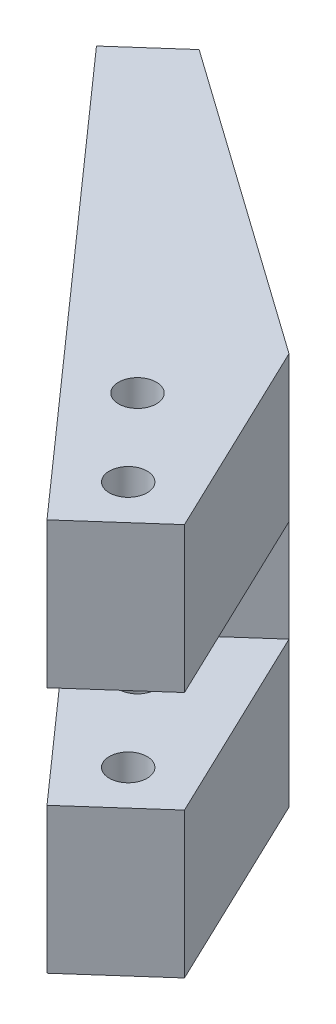
ISO-10303-21;
HEADER;
FILE_DESCRIPTION(('STEP AP214'),'2;1');
FILE_NAME('part.step','',(''),(''),'','','');
FILE_SCHEMA(('AUTOMOTIVE_DESIGN { 1 0 10303 214 1 1 1 1 }'));
ENDSEC;
DATA;
#1=APPLICATION_CONTEXT('core data for automotive mechanical design processes');
#2=APPLICATION_PROTOCOL_DEFINITION('international standard','automotive_design',2000,#1);
#3=PRODUCT_CONTEXT('',#1,'mechanical');
#4=PRODUCT('Part','Part','',(#3));
#5=PRODUCT_RELATED_PRODUCT_CATEGORY('part','',(#4));
#6=PRODUCT_DEFINITION_FORMATION('','',#4);
#7=PRODUCT_DEFINITION_CONTEXT('part definition',#1,'design');
#8=PRODUCT_DEFINITION('design','',#6,#7);
#9=PRODUCT_DEFINITION_SHAPE('','',#8);
#10=(LENGTH_UNIT() NAMED_UNIT(*) SI_UNIT(.MILLI.,.METRE.));
#11=(NAMED_UNIT(*) PLANE_ANGLE_UNIT() SI_UNIT($,.RADIAN.));
#12=(NAMED_UNIT(*) SI_UNIT($,.STERADIAN.) SOLID_ANGLE_UNIT());
#13=UNCERTAINTY_MEASURE_WITH_UNIT(LENGTH_MEASURE(1.E-05),#10,'distance_accuracy_value','');
#14=(GEOMETRIC_REPRESENTATION_CONTEXT(3) GLOBAL_UNCERTAINTY_ASSIGNED_CONTEXT((#13)) GLOBAL_UNIT_ASSIGNED_CONTEXT((#10,
#11,#12)) REPRESENTATION_CONTEXT('',''));
#15=CARTESIAN_POINT('',(0.,0.,0.));
#16=DIRECTION('',(0.,0.,1.));
#17=DIRECTION('',(1.,0.,0.));
#18=AXIS2_PLACEMENT_3D('',#15,#16,#17);
#19=CARTESIAN_POINT('',(-42.4038381091014,-17.,-30.0407554689908));
#20=DIRECTION('',(0.578077609110316,0.,-0.815981787692164));
#21=DIRECTION('',(-0.815981787692164,0.,-0.578077609110316));
#22=AXIS2_PLACEMENT_3D('',#19,#20,#21);
#23=PLANE('',#22);
#24=DIRECTION('',(0.815981787692164,0.,0.578077609110316));
#25=VECTOR('',#24,1.);
#26=CARTESIAN_POINT('',(-42.4038381091014,-20.,-30.0407554689908));
#27=LINE('',#26,#25);
#28=CARTESIAN_POINT('',(-42.4038381091014,-20.,-30.0407554689908));
#29=VERTEX_POINT('',#28);
#30=CARTESIAN_POINT('',(0.,-20.,0.));
#31=VERTEX_POINT('',#30);
#32=EDGE_CURVE('E240',#29,#31,#27,.T.);
#33=ORIENTED_EDGE('',*,*,#32,.F.);
#34=DIRECTION('',(0.,-1.,0.));
#35=VECTOR('',#34,1.);
#36=CARTESIAN_POINT('',(-42.4038381091014,-17.,-30.0407554689908));
#37=LINE('',#36,#35);
#38=CARTESIAN_POINT('',(-42.4038381091014,-17.,-30.0407554689908));
#39=VERTEX_POINT('',#38);
#40=EDGE_CURVE('E228',#39,#29,#37,.T.);
#41=ORIENTED_EDGE('',*,*,#40,.F.);
#42=DIRECTION('',(0.815981787692164,0.,0.578077609110316));
#43=VECTOR('',#42,1.);
#44=CARTESIAN_POINT('',(-42.4038381091014,-17.,-30.0407554689908));
#45=LINE('',#44,#43);
#46=CARTESIAN_POINT('',(0.,-17.,0.));
#47=VERTEX_POINT('',#46);
#48=EDGE_CURVE('E229',#39,#47,#45,.T.);
#49=ORIENTED_EDGE('',*,*,#48,.T.);
#50=DIRECTION('',(0.,-1.,0.));
#51=VECTOR('',#50,1.);
#52=CARTESIAN_POINT('',(0.,-17.,0.));
#53=LINE('',#52,#51);
#54=EDGE_CURVE('E245',#47,#31,#53,.T.);
#55=ORIENTED_EDGE('',*,*,#54,.T.);
#56=EDGE_LOOP('',(#33,#41,#49,#55));
#57=FACE_BOUND('',#56,.T.);
#58=ADVANCED_FACE('F42',(#57),#23,.T.);
#59=CARTESIAN_POINT('',(-49.8875630877834,-17.,-23.4079686909125));
#60=DIRECTION('',(-0.663278677807829,0.,-0.748372497868206));
#61=DIRECTION('',(-0.748372497868206,0.,0.663278677807829));
#62=AXIS2_PLACEMENT_3D('',#59,#60,#61);
#63=PLANE('',#62);
#64=DIRECTION('',(0.748372497868206,0.,-0.663278677807829));
#65=VECTOR('',#64,1.);
#66=CARTESIAN_POINT('',(-49.8875630877834,-20.,-23.4079686909125));
#67=LINE('',#66,#65);
#68=CARTESIAN_POINT('',(-49.8875630877834,-20.,-23.4079686909125));
#69=VERTEX_POINT('',#68);
#70=EDGE_CURVE('E226',#69,#29,#67,.T.);
#71=ORIENTED_EDGE('',*,*,#70,.F.);
#72=DIRECTION('',(0.,-1.,0.));
#73=VECTOR('',#72,1.);
#74=CARTESIAN_POINT('',(-49.8875630877834,-17.,-23.4079686909125));
#75=LINE('',#74,#73);
#76=CARTESIAN_POINT('',(-49.8875630877834,-17.,-23.4079686909125));
#77=VERTEX_POINT('',#76);
#78=EDGE_CURVE('E217',#77,#69,#75,.T.);
#79=ORIENTED_EDGE('',*,*,#78,.F.);
#80=DIRECTION('',(0.748372497868206,0.,-0.663278677807829));
#81=VECTOR('',#80,1.);
#82=CARTESIAN_POINT('',(-49.8875630877834,-17.,-23.4079686909125));
#83=LINE('',#82,#81);
#84=EDGE_CURVE('E224',#77,#39,#83,.T.);
#85=ORIENTED_EDGE('',*,*,#84,.T.);
#86=ORIENTED_EDGE('',*,*,#40,.T.);
#87=EDGE_LOOP('',(#71,#79,#85,#86));
#88=FACE_BOUND('',#87,.T.);
#89=ADVANCED_FACE('F223',(#88),#63,.T.);
#90=CARTESIAN_POINT('',(-40.458581161233,34.,-20.0771580044902));
#91=DIRECTION('',(0.333081068642229,0.,-0.942898192655045));
#92=DIRECTION('',(-0.942898192655045,0.,-0.333081068642229));
#93=AXIS2_PLACEMENT_3D('',#90,#91,#92);
#94=PLANE('',#93);
#95=DIRECTION('',(0.,-1.,0.));
#96=VECTOR('',#95,1.);
#97=CARTESIAN_POINT('',(-49.8875630877834,34.,-23.4079686909125));
#98=LINE('',#97,#96);
#99=CARTESIAN_POINT('',(-49.8875630877834,31.,-23.4079686909125));
#100=VERTEX_POINT('',#99);
#101=EDGE_CURVE('E186',#100,#77,#98,.T.);
#102=ORIENTED_EDGE('',*,*,#101,.F.);
#103=DIRECTION('',(0.942898192655045,0.,0.333081068642229));
#104=VECTOR('',#103,1.);
#105=CARTESIAN_POINT('',(-40.458581161233,31.,-20.0771580044902));
#106=LINE('',#105,#104);
#107=CARTESIAN_POINT('',(-40.458581161233,31.,-20.0771580044902));
#108=VERTEX_POINT('',#107);
#109=EDGE_CURVE('E68',#100,#108,#106,.T.);
#110=ORIENTED_EDGE('',*,*,#109,.T.);
#111=DIRECTION('',(0.,-1.,0.));
#112=VECTOR('',#111,1.);
#113=CARTESIAN_POINT('',(-40.458581161233,34.,-20.0771580044902));
#114=LINE('',#113,#112);
#115=CARTESIAN_POINT('',(-40.458581161233,-17.,-20.0771580044902));
#116=VERTEX_POINT('',#115);
#117=EDGE_CURVE('E208',#108,#116,#114,.T.);
#118=ORIENTED_EDGE('',*,*,#117,.T.);
#119=DIRECTION('',(0.942898192655045,0.,0.333081068642229));
#120=VECTOR('',#119,1.);
#121=CARTESIAN_POINT('',(-40.458581161233,-17.,-20.0771580044902));
#122=LINE('',#121,#120);
#123=EDGE_CURVE('E236',#77,#116,#122,.T.);
#124=ORIENTED_EDGE('',*,*,#123,.F.);
#125=EDGE_LOOP('',(#102,#110,#118,#124));
#126=FACE_BOUND('',#125,.T.);
#127=ADVANCED_FACE('F242',(#126),#94,.T.);
#128=CARTESIAN_POINT('',(-1.2133730085125,31.,-66.5476518448374));
#129=DIRECTION('',(0.663278677807829,0.,0.748372497868206));
#130=DIRECTION('',(0.748372497868206,0.,-0.663278677807829));
#131=AXIS2_PLACEMENT_3D('',#128,#129,#130);
#132=PLANE('',#131);
#133=DIRECTION('',(0.748372497868206,0.,-0.663278677807829));
#134=VECTOR('',#133,1.);
#135=CARTESIAN_POINT('',(-1.2133730085125,34.,-66.5476518448374));
#136=LINE('',#135,#134);
#137=CARTESIAN_POINT('',(-49.8875630877834,34.,-23.4079686909125));
#138=VERTEX_POINT('',#137);
#139=CARTESIAN_POINT('',(-42.4038381091014,34.,-30.0407554689908));
#140=VERTEX_POINT('',#139);
#141=EDGE_CURVE('E307',#138,#140,#136,.T.);
#142=ORIENTED_EDGE('',*,*,#141,.T.);
#143=DIRECTION('',(0.,1.,0.));
#144=VECTOR('',#143,1.);
#145=CARTESIAN_POINT('',(-42.4038381091014,31.,-30.0407554689908));
#146=LINE('',#145,#144);
#147=CARTESIAN_POINT('',(-42.4038381091014,31.,-30.0407554689908));
#148=VERTEX_POINT('',#147);
#149=EDGE_CURVE('E310',#148,#140,#146,.T.);
#150=ORIENTED_EDGE('',*,*,#149,.F.);
#151=DIRECTION('',(0.748372497868206,0.,-0.663278677807829));
#152=VECTOR('',#151,1.);
#153=CARTESIAN_POINT('',(-1.2133730085125,31.,-66.5476518448374));
#154=LINE('',#153,#152);
#155=EDGE_CURVE('E306',#100,#148,#154,.T.);
#156=ORIENTED_EDGE('',*,*,#155,.F.);
#157=EDGE_CURVE('E210',#138,#100,#98,.T.);
#158=ORIENTED_EDGE('',*,*,#157,.F.);
#159=EDGE_LOOP('',(#142,#150,#156,#158));
#160=FACE_BOUND('',#159,.T.);
#161=ADVANCED_FACE('F422',(#160),#132,.F.);
#162=CARTESIAN_POINT('',(0.,-17.,0.));
#163=DIRECTION('',(0.,1.,0.));
#164=DIRECTION('',(0.,0.,1.));
#165=AXIS2_PLACEMENT_3D('',#162,#163,#164);
#166=PLANE('',#165);
#167=DIRECTION('',(0.663278677807826,0.,0.748372497868209));
#168=VECTOR('',#167,1.);
#169=CARTESIAN_POINT('',(-40.458581161233,-17.,-20.0771580044902));
#170=LINE('',#169,#168);
#171=CARTESIAN_POINT('',(-20.5602208269982,-17.,2.37401693155606));
#172=VERTEX_POINT('',#171);
#173=EDGE_CURVE('E244',#116,#172,#170,.T.);
#174=ORIENTED_EDGE('',*,*,#173,.T.);
#175=CARTESIAN_POINT('',(-20.6309126816825,-17.,-88.4563203334623));
#176=DIRECTION('',(0.,1.,0.));
#177=DIRECTION('',(0.,0.,1.));
#178=AXIS2_PLACEMENT_3D('',#175,#176,#177);
#179=CIRCLE('',#178,90.8303647742059);
#180=EDGE_CURVE('E249',#172,#47,#179,.T.);
#181=ORIENTED_EDGE('',*,*,#180,.T.);
#182=ORIENTED_EDGE('',*,*,#48,.F.);
#183=ORIENTED_EDGE('',*,*,#84,.F.);
#184=ORIENTED_EDGE('',*,*,#123,.T.);
#185=EDGE_LOOP('',(#174,#181,#182,#183,#184));
#186=FACE_BOUND('',#185,.T.);
#187=ADVANCED_FACE('F235',(#186),#166,.T.);
#188=CARTESIAN_POINT('',(0.,31.,0.));
#189=DIRECTION('',(0.,1.,0.));
#190=DIRECTION('',(0.,0.,1.));
#191=AXIS2_PLACEMENT_3D('',#188,#189,#190);
#192=PLANE('',#191);
#193=CARTESIAN_POINT('',(-20.6309126816825,31.,-88.4563203334623));
#194=DIRECTION('',(0.,1.,0.));
#195=DIRECTION('',(0.,0.,1.));
#196=AXIS2_PLACEMENT_3D('',#193,#194,#195);
#197=CIRCLE('',#196,90.8303647742059);
#198=CARTESIAN_POINT('',(-20.5602208269982,31.,2.37401693155606));
#199=VERTEX_POINT('',#198);
#200=CARTESIAN_POINT('',(0.,31.,0.));
#201=VERTEX_POINT('',#200);
#202=EDGE_CURVE('E181',#199,#201,#197,.T.);
#203=ORIENTED_EDGE('',*,*,#202,.F.);
#204=DIRECTION('',(0.663278677807826,0.,0.748372497868209));
#205=VECTOR('',#204,1.);
#206=CARTESIAN_POINT('',(-40.458581161233,31.,-20.0771580044902));
#207=LINE('',#206,#205);
#208=EDGE_CURVE('E60',#108,#199,#207,.T.);
#209=ORIENTED_EDGE('',*,*,#208,.F.);
#210=ORIENTED_EDGE('',*,*,#109,.F.);
#211=ORIENTED_EDGE('',*,*,#155,.T.);
#212=DIRECTION('',(0.815981787692164,0.,0.578077609110317));
#213=VECTOR('',#212,1.);
#214=CARTESIAN_POINT('',(-55.4615209459452,31.,-39.2913958493263));
#215=LINE('',#214,#213);
#216=EDGE_CURVE('E303',#148,#201,#215,.T.);
#217=ORIENTED_EDGE('',*,*,#216,.T.);
#218=EDGE_LOOP('',(#203,#209,#210,#211,#217));
#219=FACE_BOUND('',#218,.T.);
#220=ADVANCED_FACE('F419',(#219),#192,.F.);
#221=CARTESIAN_POINT('',(-40.458581161233,34.,-20.0771580044902));
#222=DIRECTION('',(0.748372497868209,0.,-0.663278677807826));
#223=DIRECTION('',(-0.663278677807826,0.,-0.748372497868209));
#224=AXIS2_PLACEMENT_3D('',#221,#222,#223);
#225=PLANE('',#224);
#226=ORIENTED_EDGE('',*,*,#117,.F.);
#227=ORIENTED_EDGE('',*,*,#208,.T.);
#228=DIRECTION('',(0.,-1.,0.));
#229=VECTOR('',#228,1.);
#230=CARTESIAN_POINT('',(-20.5602208269982,34.,2.37401693155606));
#231=LINE('',#230,#229);
#232=EDGE_CURVE('E205',#199,#172,#231,.T.);
#233=ORIENTED_EDGE('',*,*,#232,.T.);
#234=ORIENTED_EDGE('',*,*,#173,.F.);
#235=EDGE_LOOP('',(#226,#227,#233,#234));
#236=FACE_BOUND('',#235,.T.);
#237=ADVANCED_FACE('F416',(#236),#225,.T.);
#238=CARTESIAN_POINT('',(-55.4615209459452,31.,-39.2913958493263));
#239=DIRECTION('',(-0.578077609110316,0.,0.815981787692164));
#240=DIRECTION('',(0.815981787692164,0.,0.578077609110317));
#241=AXIS2_PLACEMENT_3D('',#238,#239,#240);
#242=PLANE('',#241);
#243=DIRECTION('',(0.815981787692164,0.,0.578077609110317));
#244=VECTOR('',#243,1.);
#245=CARTESIAN_POINT('',(-55.4615209459452,34.,-39.2913958493263));
#246=LINE('',#245,#244);
#247=CARTESIAN_POINT('',(0.,34.,0.));
#248=VERTEX_POINT('',#247);
#249=EDGE_CURVE('E298',#140,#248,#246,.T.);
#250=ORIENTED_EDGE('',*,*,#249,.T.);
#251=DIRECTION('',(0.,-1.,0.));
#252=VECTOR('',#251,1.);
#253=CARTESIAN_POINT('',(0.,34.,0.));
#254=LINE('',#253,#252);
#255=EDGE_CURVE('E162',#248,#201,#254,.T.);
#256=ORIENTED_EDGE('',*,*,#255,.T.);
#257=ORIENTED_EDGE('',*,*,#216,.F.);
#258=ORIENTED_EDGE('',*,*,#149,.T.);
#259=EDGE_LOOP('',(#250,#256,#257,#258));
#260=FACE_BOUND('',#259,.T.);
#261=ADVANCED_FACE('F412',(#260),#242,.F.);
#262=CARTESIAN_POINT('',(-20.6309126816825,-20.,-88.4563203334623));
#263=DIRECTION('',(0.,-1.,0.));
#264=DIRECTION('',(0.,0.,-1.));
#265=AXIS2_PLACEMENT_3D('',#262,#263,#264);
#266=PLANE('',#265);
#267=CARTESIAN_POINT('',(-5.73347810284436,-20.,15.1032992359979));
#268=DIRECTION('',(0.,-1.,0.));
#269=DIRECTION('',(0.,0.,-1.));
#270=AXIS2_PLACEMENT_3D('',#267,#268,#269);
#271=CIRCLE('',#270,2.6);
#272=CARTESIAN_POINT('',(-5.73347810284436,-20.,12.5032992359979));
#273=VERTEX_POINT('',#272);
#274=EDGE_CURVE('E353',#273,#273,#271,.T.);
#275=ORIENTED_EDGE('',*,*,#274,.F.);
#276=EDGE_LOOP('',(#275));
#277=FACE_BOUND('',#276,.T.);
#278=CARTESIAN_POINT('',(4.21570206427303,-20.,26.328886704021));
#279=DIRECTION('',(0.,-1.,0.));
#280=DIRECTION('',(0.,0.,-1.));
#281=AXIS2_PLACEMENT_3D('',#278,#279,#280);
#282=CIRCLE('',#281,2.6);
#283=CARTESIAN_POINT('',(4.21570206427303,-20.,23.728886704021));
#284=VERTEX_POINT('',#283);
#285=EDGE_CURVE('E359',#284,#284,#282,.T.);
#286=ORIENTED_EDGE('',*,*,#285,.F.);
#287=EDGE_LOOP('',(#286));
#288=FACE_BOUND('',#287,.T.);
#289=ORIENTED_EDGE('',*,*,#32,.T.);
#290=DIRECTION('',(0.43130497023072,0.,0.902206197415135));
#291=VECTOR('',#290,1.);
#292=CARTESIAN_POINT('',(0.,-20.,0.));
#293=LINE('',#292,#291);
#294=CARTESIAN_POINT('',(13.1679328101233,-20.,27.544756978071));
#295=VERTEX_POINT('',#294);
#296=EDGE_CURVE('E276',#31,#295,#293,.T.);
#297=ORIENTED_EDGE('',*,*,#296,.T.);
#298=DIRECTION('',(0.748372497868209,0.,-0.663278677807826));
#299=VECTOR('',#298,1.);
#300=CARTESIAN_POINT('',(51.8190634145393,-20.,-6.7115403552783));
#301=LINE('',#300,#299);
#302=CARTESIAN_POINT('',(3.14487333526832,-20.,36.4281427986463));
#303=VERTEX_POINT('',#302);
#304=EDGE_CURVE('E52',#303,#295,#301,.T.);
#305=ORIENTED_EDGE('',*,*,#304,.F.);
#306=DIRECTION('',(-0.663278677807826,0.,-0.748372497868209));
#307=VECTOR('',#306,1.);
#308=CARTESIAN_POINT('',(-49.8875630877834,-20.,-23.4079686909125));
#309=LINE('',#308,#307);
#310=EDGE_CURVE('E201',#303,#69,#309,.T.);
#311=ORIENTED_EDGE('',*,*,#310,.T.);
#312=ORIENTED_EDGE('',*,*,#70,.T.);
#313=EDGE_LOOP('',(#289,#297,#305,#311,#312));
#314=FACE_BOUND('',#313,.T.);
#315=ADVANCED_FACE('F283',(#277,#288,#314),#266,.T.);
#316=CARTESIAN_POINT('',(-20.6309126816825,34.,-88.4563203334623));
#317=DIRECTION('',(0.,-1.,0.));
#318=DIRECTION('',(0.,0.,-1.));
#319=AXIS2_PLACEMENT_3D('',#316,#317,#318);
#320=PLANE('',#319);
#321=CARTESIAN_POINT('',(-5.73347810284436,34.,15.1032992359979));
#322=DIRECTION('',(0.,-1.,0.));
#323=DIRECTION('',(0.,0.,-1.));
#324=AXIS2_PLACEMENT_3D('',#321,#322,#323);
#325=CIRCLE('',#324,2.6);
#326=CARTESIAN_POINT('',(-5.73347810284436,34.,12.5032992359979));
#327=VERTEX_POINT('',#326);
#328=EDGE_CURVE('E345',#327,#327,#325,.T.);
#329=ORIENTED_EDGE('',*,*,#328,.T.);
#330=EDGE_LOOP('',(#329));
#331=FACE_BOUND('',#330,.T.);
#332=CARTESIAN_POINT('',(4.21570206427303,34.,26.328886704021));
#333=DIRECTION('',(0.,-1.,0.));
#334=DIRECTION('',(0.,0.,-1.));
#335=AXIS2_PLACEMENT_3D('',#332,#333,#334);
#336=CIRCLE('',#335,2.6);
#337=CARTESIAN_POINT('',(4.21570206427303,34.,23.728886704021));
#338=VERTEX_POINT('',#337);
#339=EDGE_CURVE('E365',#338,#338,#336,.T.);
#340=ORIENTED_EDGE('',*,*,#339,.T.);
#341=EDGE_LOOP('',(#340));
#342=FACE_BOUND('',#341,.T.);
#343=DIRECTION('',(0.43130497023072,0.,0.902206197415135));
#344=VECTOR('',#343,1.);
#345=CARTESIAN_POINT('',(0.,34.,0.));
#346=LINE('',#345,#344);
#347=CARTESIAN_POINT('',(13.1679328101233,34.,27.544756978071));
#348=VERTEX_POINT('',#347);
#349=EDGE_CURVE('E193',#248,#348,#346,.T.);
#350=ORIENTED_EDGE('',*,*,#349,.F.);
#351=ORIENTED_EDGE('',*,*,#249,.F.);
#352=ORIENTED_EDGE('',*,*,#141,.F.);
#353=DIRECTION('',(-0.663278677807826,0.,-0.748372497868209));
#354=VECTOR('',#353,1.);
#355=CARTESIAN_POINT('',(-49.8875630877834,34.,-23.4079686909125));
#356=LINE('',#355,#354);
#357=CARTESIAN_POINT('',(3.14487333526832,34.,36.4281427986463));
#358=VERTEX_POINT('',#357);
#359=EDGE_CURVE('E189',#358,#138,#356,.T.);
#360=ORIENTED_EDGE('',*,*,#359,.F.);
#361=DIRECTION('',(0.748372497868209,0.,-0.663278677807826));
#362=VECTOR('',#361,1.);
#363=CARTESIAN_POINT('',(51.8190634145393,34.,-6.71154035527831));
#364=LINE('',#363,#362);
#365=EDGE_CURVE('E11',#358,#348,#364,.T.);
#366=ORIENTED_EDGE('',*,*,#365,.T.);
#367=EDGE_LOOP('',(#350,#351,#352,#360,#366));
#368=FACE_BOUND('',#367,.T.);
#369=ADVANCED_FACE('F409',(#331,#342,#368),#320,.F.);
#370=CARTESIAN_POINT('',(25.5960482713146,0.,16.5297824644116));
#371=DIRECTION('',(-0.663278677807826,0.,-0.748372497868209));
#372=DIRECTION('',(-0.748372497868209,0.,0.663278677807826));
#373=AXIS2_PLACEMENT_3D('',#370,#371,#372);
#374=PLANE('',#373);
#375=DIRECTION('',(0.,1.,0.));
#376=VECTOR('',#375,1.);
#377=CARTESIAN_POINT('',(13.1679328101233,34.,27.544756978071));
#378=LINE('',#377,#376);
#379=CARTESIAN_POINT('',(13.1679328101233,0.,27.544756978071));
#380=VERTEX_POINT('',#379);
#381=EDGE_CURVE('E265',#295,#380,#378,.T.);
#382=ORIENTED_EDGE('',*,*,#381,.T.);
#383=DIRECTION('',(-0.748372497868209,0.,0.663278677807826));
#384=VECTOR('',#383,1.);
#385=CARTESIAN_POINT('',(25.5960482713146,0.,16.5297824644116));
#386=LINE('',#385,#384);
#387=CARTESIAN_POINT('',(3.14487333526835,0.,36.4281427986463));
#388=VERTEX_POINT('',#387);
#389=EDGE_CURVE('E256',#380,#388,#386,.T.);
#390=ORIENTED_EDGE('',*,*,#389,.T.);
#391=DIRECTION('',(0.,-1.,0.));
#392=VECTOR('',#391,1.);
#393=CARTESIAN_POINT('',(3.14487333526832,0.,36.4281427986463));
#394=LINE('',#393,#392);
#395=EDGE_CURVE('E262',#388,#303,#394,.T.);
#396=ORIENTED_EDGE('',*,*,#395,.T.);
#397=ORIENTED_EDGE('',*,*,#304,.T.);
#398=EDGE_LOOP('',(#382,#390,#396,#397));
#399=FACE_BOUND('',#398,.T.);
#400=ADVANCED_FACE('F288',(#399),#374,.F.);
#401=CARTESIAN_POINT('',(25.5960482713146,14.,16.5297824644116));
#402=DIRECTION('',(-0.663278677807826,0.,-0.748372497868209));
#403=DIRECTION('',(-0.748372497868209,0.,0.663278677807826));
#404=AXIS2_PLACEMENT_3D('',#401,#402,#403);
#405=PLANE('',#404);
#406=DIRECTION('',(0.,1.,0.));
#407=VECTOR('',#406,1.);
#408=CARTESIAN_POINT('',(13.1679328101233,34.,27.544756978071));
#409=LINE('',#408,#407);
#410=CARTESIAN_POINT('',(13.1679328101233,14.,27.544756978071));
#411=VERTEX_POINT('',#410);
#412=EDGE_CURVE('E169',#411,#348,#409,.T.);
#413=ORIENTED_EDGE('',*,*,#412,.T.);
#414=ORIENTED_EDGE('',*,*,#365,.F.);
#415=DIRECTION('',(0.,-1.,0.));
#416=VECTOR('',#415,1.);
#417=CARTESIAN_POINT('',(3.14487333526832,14.,36.4281427986463));
#418=LINE('',#417,#416);
#419=CARTESIAN_POINT('',(3.14487333526832,14.,36.4281427986463));
#420=VERTEX_POINT('',#419);
#421=EDGE_CURVE('E257',#358,#420,#418,.T.);
#422=ORIENTED_EDGE('',*,*,#421,.T.);
#423=DIRECTION('',(-0.748372497868209,0.,0.663278677807826));
#424=VECTOR('',#423,1.);
#425=CARTESIAN_POINT('',(25.5960482713146,14.,16.5297824644116));
#426=LINE('',#425,#424);
#427=EDGE_CURVE('E261',#411,#420,#426,.T.);
#428=ORIENTED_EDGE('',*,*,#427,.F.);
#429=EDGE_LOOP('',(#413,#414,#422,#428));
#430=FACE_BOUND('',#429,.T.);
#431=ADVANCED_FACE('F403',(#430),#405,.F.);
#432=CARTESIAN_POINT('',(0.,34.,0.));
#433=DIRECTION('',(0.902206197415135,0.,-0.43130497023072));
#434=DIRECTION('',(-0.43130497023072,0.,-0.902206197415135));
#435=AXIS2_PLACEMENT_3D('',#432,#433,#434);
#436=PLANE('',#435);
#437=DIRECTION('',(0.431304970230721,0.,0.902206197415135));
#438=VECTOR('',#437,1.);
#439=CARTESIAN_POINT('',(0.,14.,0.));
#440=LINE('',#439,#438);
#441=CARTESIAN_POINT('',(0.,14.,0.));
#442=VERTEX_POINT('',#441);
#443=EDGE_CURVE('E165',#442,#411,#440,.T.);
#444=ORIENTED_EDGE('',*,*,#443,.F.);
#445=EDGE_CURVE('E159',#201,#442,#254,.T.);
#446=ORIENTED_EDGE('',*,*,#445,.F.);
#447=ORIENTED_EDGE('',*,*,#255,.F.);
#448=ORIENTED_EDGE('',*,*,#349,.T.);
#449=ORIENTED_EDGE('',*,*,#412,.F.);
#450=EDGE_LOOP('',(#444,#446,#447,#448,#449));
#451=FACE_BOUND('',#450,.T.);
#452=ADVANCED_FACE('F166',(#451),#436,.T.);
#453=CARTESIAN_POINT('',(-20.6309126816825,34.,-88.4563203334623));
#454=DIRECTION('',(0.,-1.,0.));
#455=DIRECTION('',(0.,0.,-1.));
#456=AXIS2_PLACEMENT_3D('',#453,#454,#455);
#457=CYLINDRICAL_SURFACE('',#456,90.8303647742059);
#458=ORIENTED_EDGE('',*,*,#232,.F.);
#459=ORIENTED_EDGE('',*,*,#202,.T.);
#460=ORIENTED_EDGE('',*,*,#445,.T.);
#461=CARTESIAN_POINT('',(0.,0.,0.));
#462=VERTEX_POINT('',#461);
#463=EDGE_CURVE('E147',#442,#462,#254,.T.);
#464=ORIENTED_EDGE('',*,*,#463,.T.);
#465=EDGE_CURVE('E160',#462,#47,#254,.T.);
#466=ORIENTED_EDGE('',*,*,#465,.T.);
#467=ORIENTED_EDGE('',*,*,#180,.F.);
#468=EDGE_LOOP('',(#458,#459,#460,#464,#466,#467));
#469=FACE_BOUND('',#468,.T.);
#470=ADVANCED_FACE('F44',(#469),#457,.F.);
#471=CARTESIAN_POINT('',(-49.8875630877834,34.,-23.4079686909125));
#472=DIRECTION('',(-0.748372497868209,0.,0.663278677807826));
#473=DIRECTION('',(0.663278677807826,0.,0.748372497868209));
#474=AXIS2_PLACEMENT_3D('',#471,#472,#473);
#475=PLANE('',#474);
#476=DIRECTION('',(-0.663278677807826,0.,-0.748372497868209));
#477=VECTOR('',#476,1.);
#478=CARTESIAN_POINT('',(-49.8875630877834,14.,-23.4079686909125));
#479=LINE('',#478,#477);
#480=CARTESIAN_POINT('',(-16.3208619204146,14.,14.465095585545));
#481=VERTEX_POINT('',#480);
#482=EDGE_CURVE('E177',#420,#481,#479,.T.);
#483=ORIENTED_EDGE('',*,*,#482,.F.);
#484=ORIENTED_EDGE('',*,*,#421,.F.);
#485=ORIENTED_EDGE('',*,*,#359,.T.);
#486=ORIENTED_EDGE('',*,*,#157,.T.);
#487=ORIENTED_EDGE('',*,*,#101,.T.);
#488=ORIENTED_EDGE('',*,*,#78,.T.);
#489=ORIENTED_EDGE('',*,*,#310,.F.);
#490=ORIENTED_EDGE('',*,*,#395,.F.);
#491=DIRECTION('',(0.663278677807826,0.,0.748372497868209));
#492=VECTOR('',#491,1.);
#493=CARTESIAN_POINT('',(-49.8875630877834,0.,-23.4079686909125));
#494=LINE('',#493,#492);
#495=CARTESIAN_POINT('',(-16.3208619204146,0.,14.465095585545));
#496=VERTEX_POINT('',#495);
#497=EDGE_CURVE('E286',#496,#388,#494,.T.);
#498=ORIENTED_EDGE('',*,*,#497,.F.);
#499=DIRECTION('',(0.,-1.,0.));
#500=VECTOR('',#499,1.);
#501=CARTESIAN_POINT('',(-16.3208619204146,34.,14.465095585545));
#502=LINE('',#501,#500);
#503=EDGE_CURVE('E294',#481,#496,#502,.T.);
#504=ORIENTED_EDGE('',*,*,#503,.F.);
#505=EDGE_LOOP('',(#483,#484,#485,#486,#487,#488,#489,#490,#498,#504));
#506=FACE_BOUND('',#505,.T.);
#507=ADVANCED_FACE('F215',(#506),#475,.T.);
#508=ORIENTED_EDGE('',*,*,#465,.F.);
#509=DIRECTION('',(0.431304970230721,0.,0.902206197415135));
#510=VECTOR('',#509,1.);
#511=CARTESIAN_POINT('',(0.,0.,0.));
#512=LINE('',#511,#510);
#513=EDGE_CURVE('E173',#462,#380,#512,.T.);
#514=ORIENTED_EDGE('',*,*,#513,.T.);
#515=ORIENTED_EDGE('',*,*,#381,.F.);
#516=ORIENTED_EDGE('',*,*,#296,.F.);
#517=ORIENTED_EDGE('',*,*,#54,.F.);
#518=EDGE_LOOP('',(#508,#514,#515,#516,#517));
#519=FACE_BOUND('',#518,.T.);
#520=ADVANCED_FACE('F336',(#519),#436,.T.);
#521=CARTESIAN_POINT('',(51.4218923340496,0.,-45.5749574641788));
#522=DIRECTION('',(0.,-1.,0.));
#523=DIRECTION('',(0.,0.,-1.));
#524=AXIS2_PLACEMENT_3D('',#521,#522,#523);
#525=PLANE('',#524);
#526=CARTESIAN_POINT('',(-5.73347810284436,0.,15.1032992359979));
#527=DIRECTION('',(0.,-1.,0.));
#528=DIRECTION('',(0.,0.,-1.));
#529=AXIS2_PLACEMENT_3D('',#526,#527,#528);
#530=CIRCLE('',#529,2.6);
#531=CARTESIAN_POINT('',(-5.73347810284436,0.,12.5032992359979));
#532=VERTEX_POINT('',#531);
#533=EDGE_CURVE('E369',#532,#532,#530,.T.);
#534=ORIENTED_EDGE('',*,*,#533,.T.);
#535=EDGE_LOOP('',(#534));
#536=FACE_BOUND('',#535,.T.);
#537=CARTESIAN_POINT('',(4.21570206427303,0.,26.328886704021));
#538=DIRECTION('',(0.,-1.,0.));
#539=DIRECTION('',(0.,0.,-1.));
#540=AXIS2_PLACEMENT_3D('',#537,#538,#539);
#541=CIRCLE('',#540,2.6);
#542=CARTESIAN_POINT('',(4.21570206427303,0.,23.728886704021));
#543=VERTEX_POINT('',#542);
#544=EDGE_CURVE('E344',#543,#543,#541,.T.);
#545=ORIENTED_EDGE('',*,*,#544,.T.);
#546=EDGE_LOOP('',(#545));
#547=FACE_BOUND('',#546,.T.);
#548=ORIENTED_EDGE('',*,*,#513,.F.);
#549=DIRECTION('',(-0.748372497868209,0.,0.663278677807826));
#550=VECTOR('',#549,1.);
#551=CARTESIAN_POINT('',(51.4218923340496,0.,-45.5749574641788));
#552=LINE('',#551,#550);
#553=EDGE_CURVE('E154',#462,#496,#552,.T.);
#554=ORIENTED_EDGE('',*,*,#553,.T.);
#555=ORIENTED_EDGE('',*,*,#497,.T.);
#556=ORIENTED_EDGE('',*,*,#389,.F.);
#557=EDGE_LOOP('',(#548,#554,#555,#556));
#558=FACE_BOUND('',#557,.T.);
#559=ADVANCED_FACE('F292',(#536,#547,#558),#525,.F.);
#560=CARTESIAN_POINT('',(51.4218923340496,14.,-45.5749574641788));
#561=DIRECTION('',(0.,1.,0.));
#562=DIRECTION('',(0.,0.,1.));
#563=AXIS2_PLACEMENT_3D('',#560,#561,#562);
#564=PLANE('',#563);
#565=CARTESIAN_POINT('',(-5.73347810284436,14.,15.1032992359979));
#566=DIRECTION('',(0.,1.,0.));
#567=DIRECTION('',(0.,0.,1.));
#568=AXIS2_PLACEMENT_3D('',#565,#566,#567);
#569=CIRCLE('',#568,2.6);
#570=CARTESIAN_POINT('',(-5.73347810284436,14.,17.7032992359979));
#571=VERTEX_POINT('',#570);
#572=EDGE_CURVE('E46',#571,#571,#569,.T.);
#573=ORIENTED_EDGE('',*,*,#572,.T.);
#574=EDGE_LOOP('',(#573));
#575=FACE_BOUND('',#574,.T.);
#576=CARTESIAN_POINT('',(4.21570206427303,14.,26.328886704021));
#577=DIRECTION('',(0.,1.,0.));
#578=DIRECTION('',(0.,0.,1.));
#579=AXIS2_PLACEMENT_3D('',#576,#577,#578);
#580=CIRCLE('',#579,2.6);
#581=CARTESIAN_POINT('',(4.21570206427303,14.,28.928886704021));
#582=VERTEX_POINT('',#581);
#583=EDGE_CURVE('E341',#582,#582,#580,.T.);
#584=ORIENTED_EDGE('',*,*,#583,.T.);
#585=EDGE_LOOP('',(#584));
#586=FACE_BOUND('',#585,.T.);
#587=ORIENTED_EDGE('',*,*,#482,.T.);
#588=DIRECTION('',(-0.748372497868209,0.,0.663278677807826));
#589=VECTOR('',#588,1.);
#590=CARTESIAN_POINT('',(51.4218923340496,14.,-45.5749574641788));
#591=LINE('',#590,#589);
#592=EDGE_CURVE('E151',#442,#481,#591,.T.);
#593=ORIENTED_EDGE('',*,*,#592,.F.);
#594=ORIENTED_EDGE('',*,*,#443,.T.);
#595=ORIENTED_EDGE('',*,*,#427,.T.);
#596=EDGE_LOOP('',(#587,#593,#594,#595));
#597=FACE_BOUND('',#596,.T.);
#598=ADVANCED_FACE('F175',(#575,#586,#597),#564,.F.);
#599=CARTESIAN_POINT('',(51.4218923340496,14.,-45.5749574641788));
#600=DIRECTION('',(-0.663278677807826,0.,-0.748372497868209));
#601=DIRECTION('',(-0.748372497868209,0.,0.663278677807826));
#602=AXIS2_PLACEMENT_3D('',#599,#600,#601);
#603=PLANE('',#602);
#604=ORIENTED_EDGE('',*,*,#503,.T.);
#605=ORIENTED_EDGE('',*,*,#553,.F.);
#606=ORIENTED_EDGE('',*,*,#463,.F.);
#607=ORIENTED_EDGE('',*,*,#592,.T.);
#608=EDGE_LOOP('',(#604,#605,#606,#607));
#609=FACE_BOUND('',#608,.T.);
#610=ADVANCED_FACE('F149',(#609),#603,.F.);
#611=CARTESIAN_POINT('',(4.21570206427303,34.,26.328886704021));
#612=DIRECTION('',(0.,-1.,0.));
#613=DIRECTION('',(0.,0.,-1.));
#614=AXIS2_PLACEMENT_3D('',#611,#612,#613);
#615=CYLINDRICAL_SURFACE('',#614,2.6);
#616=ORIENTED_EDGE('',*,*,#339,.F.);
#617=EDGE_LOOP('',(#616));
#618=FACE_BOUND('',#617,.T.);
#619=ORIENTED_EDGE('',*,*,#583,.F.);
#620=EDGE_LOOP('',(#619));
#621=FACE_BOUND('',#620,.T.);
#622=ADVANCED_FACE('F381',(#618,#621),#615,.F.);
#623=CARTESIAN_POINT('',(-5.73347810284436,34.,15.1032992359979));
#624=DIRECTION('',(0.,-1.,0.));
#625=DIRECTION('',(0.,0.,-1.));
#626=AXIS2_PLACEMENT_3D('',#623,#624,#625);
#627=CYLINDRICAL_SURFACE('',#626,2.6);
#628=ORIENTED_EDGE('',*,*,#328,.F.);
#629=EDGE_LOOP('',(#628));
#630=FACE_BOUND('',#629,.T.);
#631=ORIENTED_EDGE('',*,*,#572,.F.);
#632=EDGE_LOOP('',(#631));
#633=FACE_BOUND('',#632,.T.);
#634=ADVANCED_FACE('F378',(#630,#633),#627,.F.);
#635=ORIENTED_EDGE('',*,*,#285,.T.);
#636=EDGE_LOOP('',(#635));
#637=FACE_BOUND('',#636,.T.);
#638=ORIENTED_EDGE('',*,*,#544,.F.);
#639=EDGE_LOOP('',(#638));
#640=FACE_BOUND('',#639,.T.);
#641=ADVANCED_FACE('F380',(#637,#640),#615,.F.);
#642=ORIENTED_EDGE('',*,*,#274,.T.);
#643=EDGE_LOOP('',(#642));
#644=FACE_BOUND('',#643,.T.);
#645=ORIENTED_EDGE('',*,*,#533,.F.);
#646=EDGE_LOOP('',(#645));
#647=FACE_BOUND('',#646,.T.);
#648=ADVANCED_FACE('F384',(#644,#647),#627,.F.);
#649=CLOSED_SHELL('',(#58,#89,#127,#161,#187,#220,#237,#261,#315,#369,#400,#431,#452,#470,#507,
#520,#559,#598,#610,#622,#634,#641,#648));
#650=MANIFOLD_SOLID_BREP('B2',#649);
#651=ADVANCED_BREP_SHAPE_REPRESENTATION('',(#18,#650),#14);
#652=SHAPE_DEFINITION_REPRESENTATION(#9,#651);
ENDSEC;
END-ISO-10303-21;
